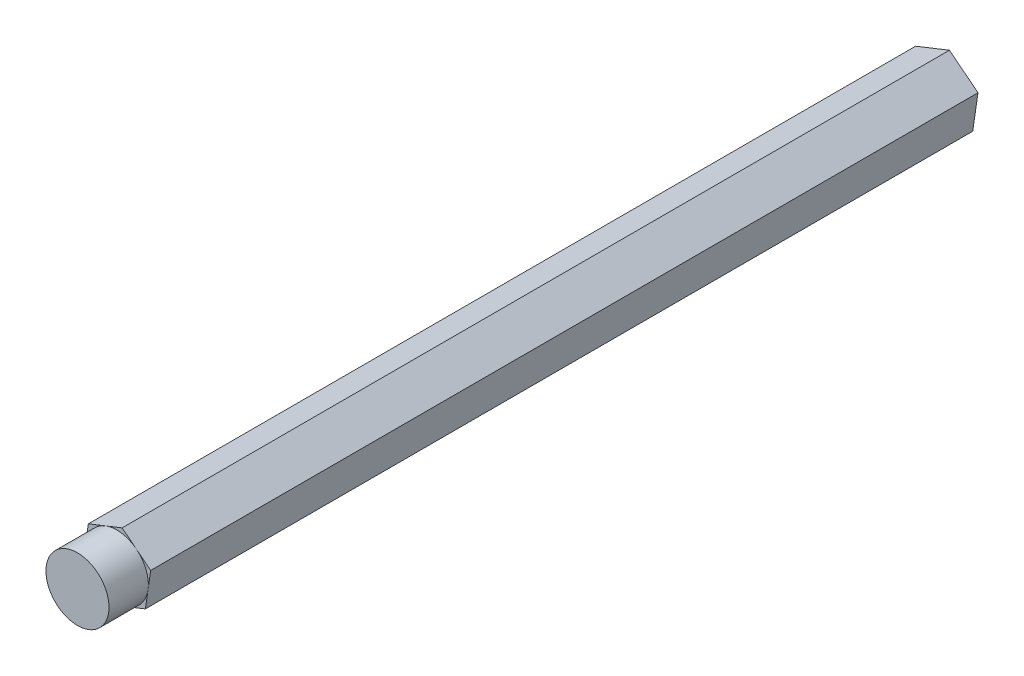
ISO-10303-21;
HEADER;
FILE_DESCRIPTION(('STEP AP214'),'2;1');
FILE_NAME('part.step','',(''),(''),'','','');
FILE_SCHEMA(('AUTOMOTIVE_DESIGN { 1 0 10303 214 1 1 1 1 }'));
ENDSEC;
DATA;
#1=APPLICATION_CONTEXT('core data for automotive mechanical design processes');
#2=APPLICATION_PROTOCOL_DEFINITION('international standard','automotive_design',2000,#1);
#3=PRODUCT_CONTEXT('',#1,'mechanical');
#4=PRODUCT('Part','Part','',(#3));
#5=PRODUCT_RELATED_PRODUCT_CATEGORY('part','',(#4));
#6=PRODUCT_DEFINITION_FORMATION('','',#4);
#7=PRODUCT_DEFINITION_CONTEXT('part definition',#1,'design');
#8=PRODUCT_DEFINITION('design','',#6,#7);
#9=PRODUCT_DEFINITION_SHAPE('','',#8);
#10=(LENGTH_UNIT() NAMED_UNIT(*) SI_UNIT(.MILLI.,.METRE.));
#11=(NAMED_UNIT(*) PLANE_ANGLE_UNIT() SI_UNIT($,.RADIAN.));
#12=(NAMED_UNIT(*) SI_UNIT($,.STERADIAN.) SOLID_ANGLE_UNIT());
#13=UNCERTAINTY_MEASURE_WITH_UNIT(LENGTH_MEASURE(1.E-05),#10,'distance_accuracy_value','');
#14=(GEOMETRIC_REPRESENTATION_CONTEXT(3) GLOBAL_UNCERTAINTY_ASSIGNED_CONTEXT((#13)) GLOBAL_UNIT_ASSIGNED_CONTEXT((#10,
#11,#12)) REPRESENTATION_CONTEXT('',''));
#15=CARTESIAN_POINT('',(0.,0.,0.));
#16=DIRECTION('',(0.,0.,1.));
#17=DIRECTION('',(1.,0.,0.));
#18=AXIS2_PLACEMENT_3D('',#15,#16,#17);
#19=CARTESIAN_POINT('',(6.81512256836031,2.705076285719,174.6377));
#20=DIRECTION('',(-0.620473942514407,-0.7842270632034,0.));
#21=DIRECTION('',(0.7842270632034,-0.620473942514407,0.));
#22=AXIS2_PLACEMENT_3D('',#19,#20,#21);
#23=PLANE('',#22);
#24=DIRECTION('',(-0.7842270632034,0.620473942514407,0.));
#25=VECTOR('',#24,1.);
#26=CARTESIAN_POINT('',(6.81512256836031,2.705076285719,166.7002));
#27=LINE('',#26,#25);
#28=CARTESIAN_POINT('',(6.81512256836031,2.70507628571899,166.7002));
#29=VERTEX_POINT('',#28);
#30=CARTESIAN_POINT('',(3.94000953496648,4.97984185134158,166.7002));
#31=VERTEX_POINT('',#30);
#32=EDGE_CURVE('E105',#29,#31,#27,.T.);
#33=ORIENTED_EDGE('',*,*,#32,.F.);
#34=DIRECTION('',(0.,0.,-1.));
#35=VECTOR('',#34,1.);
#36=CARTESIAN_POINT('',(6.81512256836031,2.705076285719,174.6377));
#37=LINE('',#36,#35);
#38=CARTESIAN_POINT('',(6.81512256836031,2.705076285719,0.));
#39=VERTEX_POINT('',#38);
#40=EDGE_CURVE('E55',#29,#39,#37,.T.);
#41=ORIENTED_EDGE('',*,*,#40,.T.);
#42=DIRECTION('',(-0.7842270632034,0.620473942514407,0.));
#43=VECTOR('',#42,1.);
#44=CARTESIAN_POINT('',(6.81512256836031,2.705076285719,0.));
#45=LINE('',#44,#43);
#46=CARTESIAN_POINT('',(1.06489650157265,7.25460741696417,0.));
#47=VERTEX_POINT('',#46);
#48=EDGE_CURVE('E110',#39,#47,#45,.T.);
#49=ORIENTED_EDGE('',*,*,#48,.T.);
#50=DIRECTION('',(0.,0.,-1.));
#51=VECTOR('',#50,1.);
#52=CARTESIAN_POINT('',(1.06489650157265,7.25460741696417,174.6377));
#53=LINE('',#52,#51);
#54=CARTESIAN_POINT('',(1.06489650157265,7.25460741696417,166.7002));
#55=VERTEX_POINT('',#54);
#56=EDGE_CURVE('E128',#55,#47,#53,.T.);
#57=ORIENTED_EDGE('',*,*,#56,.F.);
#58=EDGE_CURVE('E111',#31,#55,#27,.T.);
#59=ORIENTED_EDGE('',*,*,#58,.F.);
#60=EDGE_LOOP('',(#33,#41,#49,#57,#59));
#61=FACE_BOUND('',#60,.T.);
#62=ADVANCED_FACE('F33',(#61),#23,.F.);
#63=CARTESIAN_POINT('',(1.06489650157265,7.25460741696417,174.6377));
#64=DIRECTION('',(0.368923587812205,-0.929459728205461,0.));
#65=DIRECTION('',(0.929459728205461,0.368923587812205,0.));
#66=AXIS2_PLACEMENT_3D('',#63,#64,#65);
#67=PLANE('',#66);
#68=DIRECTION('',(-0.929459728205461,-0.368923587812205,0.));
#69=VECTOR('',#68,1.);
#70=CARTESIAN_POINT('',(1.06489650157265,7.25460741696417,166.7002));
#71=LINE('',#70,#69);
#72=CARTESIAN_POINT('',(-2.3426647826075,5.90206927410467,166.7002));
#73=VERTEX_POINT('',#72);
#74=EDGE_CURVE('E123',#55,#73,#71,.T.);
#75=ORIENTED_EDGE('',*,*,#74,.F.);
#76=ORIENTED_EDGE('',*,*,#56,.T.);
#77=DIRECTION('',(-0.929459728205461,-0.368923587812205,0.));
#78=VECTOR('',#77,1.);
#79=CARTESIAN_POINT('',(1.06489650157265,7.25460741696417,0.));
#80=LINE('',#79,#78);
#81=CARTESIAN_POINT('',(-5.75022606678766,4.54953113124518,0.));
#82=VERTEX_POINT('',#81);
#83=EDGE_CURVE('E134',#47,#82,#80,.T.);
#84=ORIENTED_EDGE('',*,*,#83,.T.);
#85=DIRECTION('',(0.,0.,-1.));
#86=VECTOR('',#85,1.);
#87=CARTESIAN_POINT('',(-5.75022606678766,4.54953113124518,174.6377));
#88=LINE('',#87,#86);
#89=CARTESIAN_POINT('',(-5.75022606678766,4.54953113124518,166.7002));
#90=VERTEX_POINT('',#89);
#91=EDGE_CURVE('E155',#90,#82,#88,.T.);
#92=ORIENTED_EDGE('',*,*,#91,.F.);
#93=EDGE_CURVE('E129',#73,#90,#71,.T.);
#94=ORIENTED_EDGE('',*,*,#93,.F.);
#95=EDGE_LOOP('',(#75,#76,#84,#92,#94));
#96=FACE_BOUND('',#95,.T.);
#97=ADVANCED_FACE('F175',(#96),#67,.F.);
#98=CARTESIAN_POINT('',(-5.75022606678766,4.54953113124518,174.6377));
#99=DIRECTION('',(0.989397530326612,-0.145232665002062,0.));
#100=DIRECTION('',(0.145232665002062,0.989397530326612,0.));
#101=AXIS2_PLACEMENT_3D('',#98,#99,#100);
#102=PLANE('',#101);
#103=DIRECTION('',(-0.145232665002062,-0.989397530326612,0.));
#104=VECTOR('',#103,1.);
#105=CARTESIAN_POINT('',(-5.75022606678766,4.54953113124518,166.7002));
#106=LINE('',#105,#104);
#107=CARTESIAN_POINT('',(-6.28267431757398,0.92222742276309,166.7002));
#108=VERTEX_POINT('',#107);
#109=EDGE_CURVE('E217',#90,#108,#106,.T.);
#110=ORIENTED_EDGE('',*,*,#109,.F.);
#111=ORIENTED_EDGE('',*,*,#91,.T.);
#112=DIRECTION('',(-0.145232665002061,-0.989397530326612,0.));
#113=VECTOR('',#112,1.);
#114=CARTESIAN_POINT('',(-5.75022606678766,4.54953113124518,0.));
#115=LINE('',#114,#113);
#116=CARTESIAN_POINT('',(-6.81512256836031,-2.705076285719,0.));
#117=VERTEX_POINT('',#116);
#118=EDGE_CURVE('E137',#82,#117,#115,.T.);
#119=ORIENTED_EDGE('',*,*,#118,.T.);
#120=DIRECTION('',(0.,0.,-1.));
#121=VECTOR('',#120,1.);
#122=CARTESIAN_POINT('',(-6.81512256836031,-2.705076285719,174.6377));
#123=LINE('',#122,#121);
#124=CARTESIAN_POINT('',(-6.81512256836031,-2.70507628571899,166.7002));
#125=VERTEX_POINT('',#124);
#126=EDGE_CURVE('E153',#125,#117,#123,.T.);
#127=ORIENTED_EDGE('',*,*,#126,.F.);
#128=EDGE_CURVE('E222',#108,#125,#106,.T.);
#129=ORIENTED_EDGE('',*,*,#128,.F.);
#130=EDGE_LOOP('',(#110,#111,#119,#127,#129));
#131=FACE_BOUND('',#130,.T.);
#132=ADVANCED_FACE('F179',(#131),#102,.F.);
#133=CARTESIAN_POINT('',(-6.81512256836031,-2.705076285719,174.6377));
#134=DIRECTION('',(0.620473942514407,0.7842270632034,0.));
#135=DIRECTION('',(-0.7842270632034,0.620473942514407,0.));
#136=AXIS2_PLACEMENT_3D('',#133,#134,#135);
#137=PLANE('',#136);
#138=DIRECTION('',(0.7842270632034,-0.620473942514407,0.));
#139=VECTOR('',#138,1.);
#140=CARTESIAN_POINT('',(-6.81512256836031,-2.705076285719,166.7002));
#141=LINE('',#140,#139);
#142=CARTESIAN_POINT('',(-3.94000953496648,-4.97984185134158,166.7002));
#143=VERTEX_POINT('',#142);
#144=EDGE_CURVE('E231',#125,#143,#141,.T.);
#145=ORIENTED_EDGE('',*,*,#144,.F.);
#146=ORIENTED_EDGE('',*,*,#126,.T.);
#147=DIRECTION('',(0.7842270632034,-0.620473942514406,0.));
#148=VECTOR('',#147,1.);
#149=CARTESIAN_POINT('',(-6.81512256836031,-2.705076285719,0.));
#150=LINE('',#149,#148);
#151=CARTESIAN_POINT('',(-1.06489650157265,-7.25460741696418,0.));
#152=VERTEX_POINT('',#151);
#153=EDGE_CURVE('E140',#117,#152,#150,.T.);
#154=ORIENTED_EDGE('',*,*,#153,.T.);
#155=DIRECTION('',(0.,0.,-1.));
#156=VECTOR('',#155,1.);
#157=CARTESIAN_POINT('',(-1.06489650157265,-7.25460741696418,174.6377));
#158=LINE('',#157,#156);
#159=CARTESIAN_POINT('',(-1.06489650157265,-7.25460741696418,166.7002));
#160=VERTEX_POINT('',#159);
#161=EDGE_CURVE('E151',#160,#152,#158,.T.);
#162=ORIENTED_EDGE('',*,*,#161,.F.);
#163=EDGE_CURVE('E232',#143,#160,#141,.T.);
#164=ORIENTED_EDGE('',*,*,#163,.F.);
#165=EDGE_LOOP('',(#145,#146,#154,#162,#164));
#166=FACE_BOUND('',#165,.T.);
#167=ADVANCED_FACE('F184',(#166),#137,.F.);
#168=CARTESIAN_POINT('',(-1.06489650157265,-7.25460741696418,174.6377));
#169=DIRECTION('',(-0.368923587812205,0.929459728205461,0.));
#170=DIRECTION('',(-0.929459728205461,-0.368923587812205,0.));
#171=AXIS2_PLACEMENT_3D('',#168,#169,#170);
#172=PLANE('',#171);
#173=DIRECTION('',(0.929459728205461,0.368923587812205,0.));
#174=VECTOR('',#173,1.);
#175=CARTESIAN_POINT('',(-1.06489650157265,-7.25460741696418,166.7002));
#176=LINE('',#175,#174);
#177=CARTESIAN_POINT('',(2.3426647826075,-5.90206927410468,166.7002));
#178=VERTEX_POINT('',#177);
#179=EDGE_CURVE('E235',#160,#178,#176,.T.);
#180=ORIENTED_EDGE('',*,*,#179,.F.);
#181=ORIENTED_EDGE('',*,*,#161,.T.);
#182=DIRECTION('',(0.929459728205461,0.368923587812205,0.));
#183=VECTOR('',#182,1.);
#184=CARTESIAN_POINT('',(-1.06489650157265,-7.25460741696418,0.));
#185=LINE('',#184,#183);
#186=CARTESIAN_POINT('',(5.75022606678766,-4.54953113124519,0.));
#187=VERTEX_POINT('',#186);
#188=EDGE_CURVE('E143',#152,#187,#185,.T.);
#189=ORIENTED_EDGE('',*,*,#188,.T.);
#190=DIRECTION('',(0.,0.,-1.));
#191=VECTOR('',#190,1.);
#192=CARTESIAN_POINT('',(5.75022606678766,-4.54953113124519,174.6377));
#193=LINE('',#192,#191);
#194=CARTESIAN_POINT('',(5.75022606678766,-4.54953113124518,166.7002));
#195=VERTEX_POINT('',#194);
#196=EDGE_CURVE('E149',#195,#187,#193,.T.);
#197=ORIENTED_EDGE('',*,*,#196,.F.);
#198=EDGE_CURVE('E125',#178,#195,#176,.T.);
#199=ORIENTED_EDGE('',*,*,#198,.F.);
#200=EDGE_LOOP('',(#180,#181,#189,#197,#199));
#201=FACE_BOUND('',#200,.T.);
#202=ADVANCED_FACE('F190',(#201),#172,.F.);
#203=CARTESIAN_POINT('',(5.75022606678766,-4.54953113124519,174.6377));
#204=DIRECTION('',(-0.989397530326612,0.145232665002062,0.));
#205=DIRECTION('',(-0.145232665002062,-0.989397530326612,0.));
#206=AXIS2_PLACEMENT_3D('',#203,#204,#205);
#207=PLANE('',#206);
#208=DIRECTION('',(0.145232665002062,0.989397530326612,0.));
#209=VECTOR('',#208,1.);
#210=CARTESIAN_POINT('',(5.75022606678766,-4.54953113124519,166.7002));
#211=LINE('',#210,#209);
#212=CARTESIAN_POINT('',(6.28267431757398,-0.922227422763093,166.7002));
#213=VERTEX_POINT('',#212);
#214=EDGE_CURVE('E11',#195,#213,#211,.T.);
#215=ORIENTED_EDGE('',*,*,#214,.F.);
#216=ORIENTED_EDGE('',*,*,#196,.T.);
#217=DIRECTION('',(0.145232665002062,0.989397530326612,0.));
#218=VECTOR('',#217,1.);
#219=CARTESIAN_POINT('',(5.75022606678766,-4.54953113124519,0.));
#220=LINE('',#219,#218);
#221=EDGE_CURVE('E146',#187,#39,#220,.T.);
#222=ORIENTED_EDGE('',*,*,#221,.T.);
#223=ORIENTED_EDGE('',*,*,#40,.F.);
#224=EDGE_CURVE('E36',#213,#29,#211,.T.);
#225=ORIENTED_EDGE('',*,*,#224,.F.);
#226=EDGE_LOOP('',(#215,#216,#222,#223,#225));
#227=FACE_BOUND('',#226,.T.);
#228=ADVANCED_FACE('F194',(#227),#207,.F.);
#229=CARTESIAN_POINT('',(0.,0.,0.));
#230=DIRECTION('',(0.,0.,1.));
#231=DIRECTION('',(1.,0.,0.));
#232=AXIS2_PLACEMENT_3D('',#229,#230,#231);
#233=PLANE('',#232);
#234=ORIENTED_EDGE('',*,*,#48,.F.);
#235=ORIENTED_EDGE('',*,*,#221,.F.);
#236=ORIENTED_EDGE('',*,*,#188,.F.);
#237=ORIENTED_EDGE('',*,*,#153,.F.);
#238=ORIENTED_EDGE('',*,*,#118,.F.);
#239=ORIENTED_EDGE('',*,*,#83,.F.);
#240=EDGE_LOOP('',(#234,#235,#236,#237,#238,#239));
#241=FACE_BOUND('',#240,.T.);
#242=ADVANCED_FACE('F198',(#241),#233,.F.);
#243=CARTESIAN_POINT('',(0.,0.,166.7002));
#244=DIRECTION('',(0.,0.,1.));
#245=DIRECTION('',(1.,0.,0.));
#246=AXIS2_PLACEMENT_3D('',#243,#244,#245);
#247=PLANE('',#246);
#248=ORIENTED_EDGE('',*,*,#32,.T.);
#249=CARTESIAN_POINT('',(0.,0.,166.7002));
#250=DIRECTION('',(0.,0.,1.));
#251=DIRECTION('',(1.,0.,0.));
#252=AXIS2_PLACEMENT_3D('',#249,#250,#251);
#253=CIRCLE('',#252,6.35);
#254=EDGE_CURVE('E107',#213,#31,#253,.T.);
#255=ORIENTED_EDGE('',*,*,#254,.F.);
#256=ORIENTED_EDGE('',*,*,#224,.T.);
#257=EDGE_LOOP('',(#248,#255,#256));
#258=FACE_BOUND('',#257,.T.);
#259=ADVANCED_FACE('F106',(#258),#247,.T.);
#260=ORIENTED_EDGE('',*,*,#58,.T.);
#261=ORIENTED_EDGE('',*,*,#74,.T.);
#262=EDGE_CURVE('E117',#31,#73,#253,.T.);
#263=ORIENTED_EDGE('',*,*,#262,.F.);
#264=EDGE_LOOP('',(#260,#261,#263));
#265=FACE_BOUND('',#264,.T.);
#266=ADVANCED_FACE('F121',(#265),#247,.T.);
#267=ORIENTED_EDGE('',*,*,#93,.T.);
#268=ORIENTED_EDGE('',*,*,#109,.T.);
#269=EDGE_CURVE('E126',#73,#108,#253,.T.);
#270=ORIENTED_EDGE('',*,*,#269,.F.);
#271=EDGE_LOOP('',(#267,#268,#270));
#272=FACE_BOUND('',#271,.T.);
#273=ADVANCED_FACE('F206',(#272),#247,.T.);
#274=ORIENTED_EDGE('',*,*,#128,.T.);
#275=ORIENTED_EDGE('',*,*,#144,.T.);
#276=EDGE_CURVE('E243',#108,#143,#253,.T.);
#277=ORIENTED_EDGE('',*,*,#276,.F.);
#278=EDGE_LOOP('',(#274,#275,#277));
#279=FACE_BOUND('',#278,.T.);
#280=ADVANCED_FACE('F210',(#279),#247,.T.);
#281=ORIENTED_EDGE('',*,*,#163,.T.);
#282=ORIENTED_EDGE('',*,*,#179,.T.);
#283=EDGE_CURVE('E241',#143,#178,#253,.T.);
#284=ORIENTED_EDGE('',*,*,#283,.F.);
#285=EDGE_LOOP('',(#281,#282,#284));
#286=FACE_BOUND('',#285,.T.);
#287=ADVANCED_FACE('F171',(#286),#247,.T.);
#288=ORIENTED_EDGE('',*,*,#198,.T.);
#289=ORIENTED_EDGE('',*,*,#214,.T.);
#290=EDGE_CURVE('E47',#178,#213,#253,.T.);
#291=ORIENTED_EDGE('',*,*,#290,.F.);
#292=EDGE_LOOP('',(#288,#289,#291));
#293=FACE_BOUND('',#292,.T.);
#294=ADVANCED_FACE('F164',(#293),#247,.T.);
#295=CARTESIAN_POINT('',(0.,0.,166.7002));
#296=DIRECTION('',(0.,0.,1.));
#297=DIRECTION('',(1.,0.,0.));
#298=AXIS2_PLACEMENT_3D('',#295,#296,#297);
#299=CYLINDRICAL_SURFACE('',#298,6.35);
#300=CARTESIAN_POINT('',(0.,0.,174.6377));
#301=DIRECTION('',(0.,0.,1.));
#302=DIRECTION('',(1.,0.,0.));
#303=AXIS2_PLACEMENT_3D('',#300,#301,#302);
#304=CIRCLE('',#303,6.35);
#305=CARTESIAN_POINT('',(6.35,0.,174.6377));
#306=VERTEX_POINT('',#305);
#307=EDGE_CURVE('E157',#306,#306,#304,.T.);
#308=ORIENTED_EDGE('',*,*,#307,.F.);
#309=EDGE_LOOP('',(#308));
#310=FACE_BOUND('',#309,.T.);
#311=ORIENTED_EDGE('',*,*,#254,.T.);
#312=ORIENTED_EDGE('',*,*,#262,.T.);
#313=ORIENTED_EDGE('',*,*,#269,.T.);
#314=ORIENTED_EDGE('',*,*,#276,.T.);
#315=ORIENTED_EDGE('',*,*,#283,.T.);
#316=ORIENTED_EDGE('',*,*,#290,.T.);
#317=EDGE_LOOP('',(#311,#312,#313,#314,#315,#316));
#318=FACE_BOUND('',#317,.T.);
#319=ADVANCED_FACE('F115',(#310,#318),#299,.T.);
#320=CARTESIAN_POINT('',(0.,0.,174.6377));
#321=DIRECTION('',(0.,0.,1.));
#322=DIRECTION('',(1.,0.,0.));
#323=AXIS2_PLACEMENT_3D('',#320,#321,#322);
#324=PLANE('',#323);
#325=ORIENTED_EDGE('',*,*,#307,.T.);
#326=EDGE_LOOP('',(#325));
#327=FACE_BOUND('',#326,.T.);
#328=ADVANCED_FACE('F161',(#327),#324,.T.);
#329=CLOSED_SHELL('',(#62,#97,#132,#167,#202,#228,#242,#259,#266,#273,#280,#287,#294,#319,#328));
#330=MANIFOLD_SOLID_BREP('B2',#329);
#331=ADVANCED_BREP_SHAPE_REPRESENTATION('',(#18,#330),#14);
#332=SHAPE_DEFINITION_REPRESENTATION(#9,#331);
ENDSEC;
END-ISO-10303-21;
